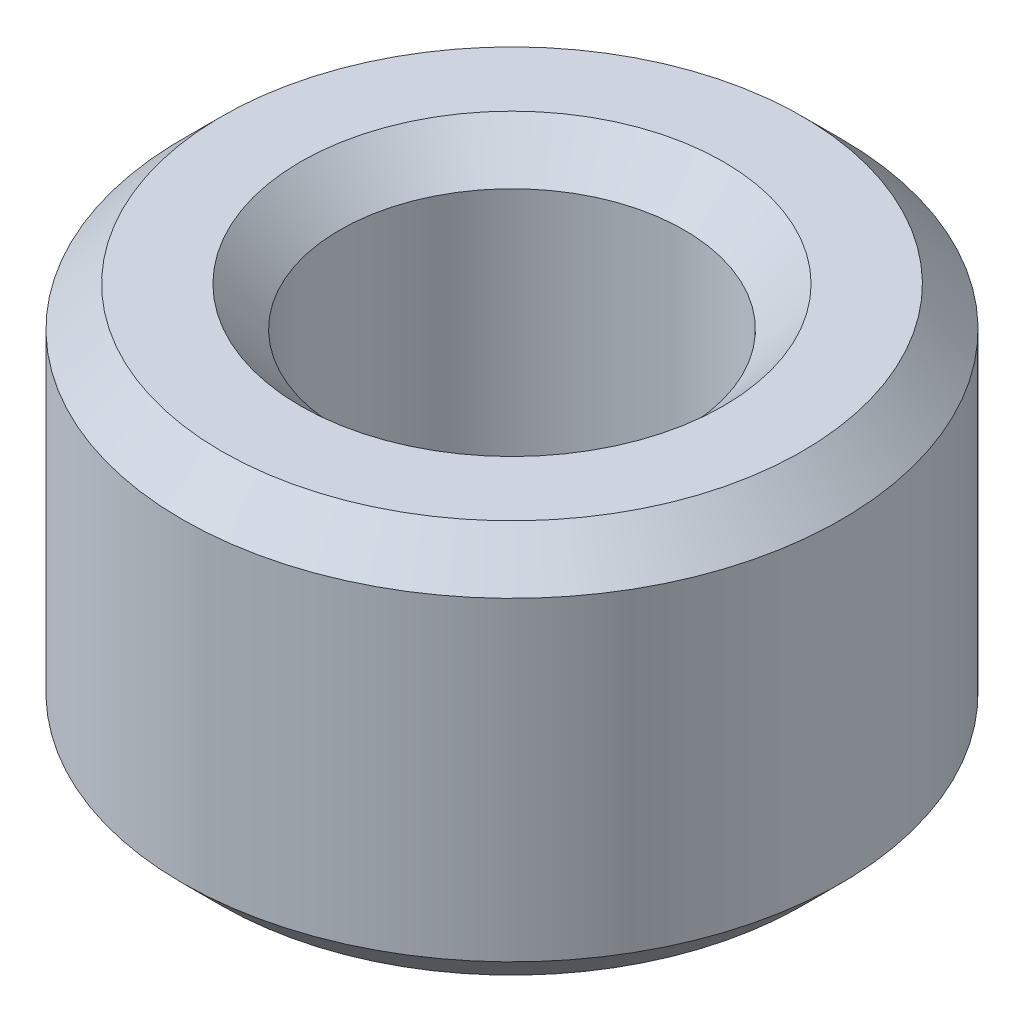
ISO-10303-21;
HEADER;
FILE_DESCRIPTION(('STEP AP214'),'2;1');
FILE_NAME('part.step','',(''),(''),'','','');
FILE_SCHEMA(('AUTOMOTIVE_DESIGN { 1 0 10303 214 1 1 1 1 }'));
ENDSEC;
DATA;
#1=APPLICATION_CONTEXT('core data for automotive mechanical design processes');
#2=APPLICATION_PROTOCOL_DEFINITION('international standard','automotive_design',2000,#1);
#3=PRODUCT_CONTEXT('',#1,'mechanical');
#4=PRODUCT('Part','Part','',(#3));
#5=PRODUCT_RELATED_PRODUCT_CATEGORY('part','',(#4));
#6=PRODUCT_DEFINITION_FORMATION('','',#4);
#7=PRODUCT_DEFINITION_CONTEXT('part definition',#1,'design');
#8=PRODUCT_DEFINITION('design','',#6,#7);
#9=PRODUCT_DEFINITION_SHAPE('','',#8);
#10=(LENGTH_UNIT() NAMED_UNIT(*) SI_UNIT(.MILLI.,.METRE.));
#11=(NAMED_UNIT(*) PLANE_ANGLE_UNIT() SI_UNIT($,.RADIAN.));
#12=(NAMED_UNIT(*) SI_UNIT($,.STERADIAN.) SOLID_ANGLE_UNIT());
#13=UNCERTAINTY_MEASURE_WITH_UNIT(LENGTH_MEASURE(1.E-05),#10,'distance_accuracy_value','');
#14=(GEOMETRIC_REPRESENTATION_CONTEXT(3) GLOBAL_UNCERTAINTY_ASSIGNED_CONTEXT((#13)) GLOBAL_UNIT_ASSIGNED_CONTEXT((#10,
#11,#12)) REPRESENTATION_CONTEXT('',''));
#15=CARTESIAN_POINT('',(0.,0.,0.));
#16=DIRECTION('',(0.,0.,1.));
#17=DIRECTION('',(1.,0.,0.));
#18=AXIS2_PLACEMENT_3D('',#15,#16,#17);
#19=CARTESIAN_POINT('',(0.,4.,0.));
#20=DIRECTION('',(0.,1.,0.));
#21=DIRECTION('',(0.,0.,1.));
#22=AXIS2_PLACEMENT_3D('',#19,#20,#21);
#23=PLANE('',#22);
#24=CARTESIAN_POINT('',(0.,4.,0.));
#25=DIRECTION('',(0.,1.,0.));
#26=DIRECTION('',(0.,0.,1.));
#27=AXIS2_PLACEMENT_3D('',#24,#25,#26);
#28=CIRCLE('',#27,2.95);
#29=CARTESIAN_POINT('',(0.,4.,2.95));
#30=VERTEX_POINT('',#29);
#31=EDGE_CURVE('E10',#30,#30,#28,.T.);
#32=ORIENTED_EDGE('',*,*,#31,.T.);
#33=EDGE_LOOP('',(#32));
#34=FACE_BOUND('',#33,.T.);
#35=CARTESIAN_POINT('',(0.,4.,0.));
#36=DIRECTION('',(0.,1.,0.));
#37=DIRECTION('',(0.,0.,1.));
#38=AXIS2_PLACEMENT_3D('',#35,#36,#37);
#39=CIRCLE('',#38,2.15);
#40=CARTESIAN_POINT('',(0.,4.,2.15));
#41=VERTEX_POINT('',#40);
#42=EDGE_CURVE('E41',#41,#41,#39,.F.);
#43=ORIENTED_EDGE('',*,*,#42,.T.);
#44=EDGE_LOOP('',(#43));
#45=FACE_BOUND('',#44,.T.);
#46=ADVANCED_FACE('F33',(#34,#45),#23,.T.);
#47=CARTESIAN_POINT('',(0.,0.,0.));
#48=DIRECTION('',(0.,1.,0.));
#49=DIRECTION('',(0.,0.,1.));
#50=AXIS2_PLACEMENT_3D('',#47,#48,#49);
#51=PLANE('',#50);
#52=CARTESIAN_POINT('',(0.,0.,0.));
#53=DIRECTION('',(0.,1.,0.));
#54=DIRECTION('',(0.,0.,1.));
#55=AXIS2_PLACEMENT_3D('',#52,#53,#54);
#56=CIRCLE('',#55,2.95);
#57=CARTESIAN_POINT('',(0.,0.,2.95));
#58=VERTEX_POINT('',#57);
#59=EDGE_CURVE('E54',#58,#58,#56,.F.);
#60=ORIENTED_EDGE('',*,*,#59,.T.);
#61=EDGE_LOOP('',(#60));
#62=FACE_BOUND('',#61,.T.);
#63=CARTESIAN_POINT('',(0.,0.,0.));
#64=DIRECTION('',(0.,1.,0.));
#65=DIRECTION('',(0.,0.,1.));
#66=AXIS2_PLACEMENT_3D('',#63,#64,#65);
#67=CIRCLE('',#66,2.15);
#68=CARTESIAN_POINT('',(0.,0.,2.15));
#69=VERTEX_POINT('',#68);
#70=EDGE_CURVE('E57',#69,#69,#67,.T.);
#71=ORIENTED_EDGE('',*,*,#70,.T.);
#72=EDGE_LOOP('',(#71));
#73=FACE_BOUND('',#72,.T.);
#74=ADVANCED_FACE('F83',(#62,#73),#51,.F.);
#75=CARTESIAN_POINT('',(0.,4.,0.));
#76=DIRECTION('',(0.,-1.,0.));
#77=DIRECTION('',(0.,0.,-1.));
#78=AXIS2_PLACEMENT_3D('',#75,#76,#77);
#79=CYLINDRICAL_SURFACE('',#78,3.35);
#80=CARTESIAN_POINT('',(0.,0.400000000000001,0.));
#81=DIRECTION('',(0.,1.,0.));
#82=DIRECTION('',(0.,0.,1.));
#83=AXIS2_PLACEMENT_3D('',#80,#81,#82);
#84=CIRCLE('',#83,3.35);
#85=CARTESIAN_POINT('',(0.,0.400000000000001,3.35));
#86=VERTEX_POINT('',#85);
#87=EDGE_CURVE('E60',#86,#86,#84,.T.);
#88=ORIENTED_EDGE('',*,*,#87,.T.);
#89=EDGE_LOOP('',(#88));
#90=FACE_BOUND('',#89,.T.);
#91=CARTESIAN_POINT('',(0.,3.6,0.));
#92=DIRECTION('',(0.,1.,0.));
#93=DIRECTION('',(0.,0.,1.));
#94=AXIS2_PLACEMENT_3D('',#91,#92,#93);
#95=CIRCLE('',#94,3.35);
#96=CARTESIAN_POINT('',(0.,3.6,3.35));
#97=VERTEX_POINT('',#96);
#98=EDGE_CURVE('E63',#97,#97,#95,.F.);
#99=ORIENTED_EDGE('',*,*,#98,.T.);
#100=EDGE_LOOP('',(#99));
#101=FACE_BOUND('',#100,.T.);
#102=ADVANCED_FACE('F67',(#90,#101),#79,.T.);
#103=CARTESIAN_POINT('',(0.,4.,0.));
#104=DIRECTION('',(0.,-1.,0.));
#105=DIRECTION('',(0.,0.,-1.));
#106=AXIS2_PLACEMENT_3D('',#103,#104,#105);
#107=CYLINDRICAL_SURFACE('',#106,1.75);
#108=CARTESIAN_POINT('',(0.,0.400000000000002,0.));
#109=DIRECTION('',(0.,1.,0.));
#110=DIRECTION('',(0.,0.,1.));
#111=AXIS2_PLACEMENT_3D('',#108,#109,#110);
#112=CIRCLE('',#111,1.75);
#113=CARTESIAN_POINT('',(0.,0.400000000000002,1.75));
#114=VERTEX_POINT('',#113);
#115=EDGE_CURVE('E45',#114,#114,#112,.F.);
#116=ORIENTED_EDGE('',*,*,#115,.T.);
#117=EDGE_LOOP('',(#116));
#118=FACE_BOUND('',#117,.T.);
#119=CARTESIAN_POINT('',(0.,3.6,0.));
#120=DIRECTION('',(0.,1.,0.));
#121=DIRECTION('',(0.,0.,1.));
#122=AXIS2_PLACEMENT_3D('',#119,#120,#121);
#123=CIRCLE('',#122,1.75);
#124=CARTESIAN_POINT('',(0.,3.6,1.75));
#125=VERTEX_POINT('',#124);
#126=EDGE_CURVE('E49',#125,#125,#123,.T.);
#127=ORIENTED_EDGE('',*,*,#126,.T.);
#128=EDGE_LOOP('',(#127));
#129=FACE_BOUND('',#128,.T.);
#130=ADVANCED_FACE('F91',(#118,#129),#107,.F.);
#131=CARTESIAN_POINT('',(0.,0.400000000000001,0.));
#132=DIRECTION('',(0.,1.,0.));
#133=DIRECTION('',(0.,0.,1.));
#134=AXIS2_PLACEMENT_3D('',#131,#132,#133);
#135=CONICAL_SURFACE('',#134,3.35,0.78539816339745);
#136=ORIENTED_EDGE('',*,*,#59,.F.);
#137=EDGE_LOOP('',(#136));
#138=FACE_BOUND('',#137,.T.);
#139=ORIENTED_EDGE('',*,*,#87,.F.);
#140=EDGE_LOOP('',(#139));
#141=FACE_BOUND('',#140,.T.);
#142=ADVANCED_FACE('F78',(#138,#141),#135,.T.);
#143=CARTESIAN_POINT('',(0.,0.,0.));
#144=DIRECTION('',(0.,-1.,0.));
#145=DIRECTION('',(0.,0.,-1.));
#146=AXIS2_PLACEMENT_3D('',#143,#144,#145);
#147=CONICAL_SURFACE('',#146,2.15,0.785398163397446);
#148=ORIENTED_EDGE('',*,*,#115,.F.);
#149=EDGE_LOOP('',(#148));
#150=FACE_BOUND('',#149,.T.);
#151=ORIENTED_EDGE('',*,*,#70,.F.);
#152=EDGE_LOOP('',(#151));
#153=FACE_BOUND('',#152,.T.);
#154=ADVANCED_FACE('F72',(#150,#153),#147,.F.);
#155=CARTESIAN_POINT('',(0.,4.,0.));
#156=DIRECTION('',(0.,-1.,0.));
#157=DIRECTION('',(0.,0.,-1.));
#158=AXIS2_PLACEMENT_3D('',#155,#156,#157);
#159=CONICAL_SURFACE('',#158,2.95,0.785398163397446);
#160=ORIENTED_EDGE('',*,*,#98,.F.);
#161=EDGE_LOOP('',(#160));
#162=FACE_BOUND('',#161,.T.);
#163=ORIENTED_EDGE('',*,*,#31,.F.);
#164=EDGE_LOOP('',(#163));
#165=FACE_BOUND('',#164,.T.);
#166=ADVANCED_FACE('F69',(#162,#165),#159,.T.);
#167=CARTESIAN_POINT('',(0.,3.6,0.));
#168=DIRECTION('',(0.,1.,0.));
#169=DIRECTION('',(0.,0.,1.));
#170=AXIS2_PLACEMENT_3D('',#167,#168,#169);
#171=CONICAL_SURFACE('',#170,1.75,0.785398163397451);
#172=ORIENTED_EDGE('',*,*,#42,.F.);
#173=EDGE_LOOP('',(#172));
#174=FACE_BOUND('',#173,.T.);
#175=ORIENTED_EDGE('',*,*,#126,.F.);
#176=EDGE_LOOP('',(#175));
#177=FACE_BOUND('',#176,.T.);
#178=ADVANCED_FACE('F36',(#174,#177),#171,.F.);
#179=CLOSED_SHELL('',(#46,#74,#102,#130,#142,#154,#166,#178));
#180=MANIFOLD_SOLID_BREP('B2',#179);
#181=ADVANCED_BREP_SHAPE_REPRESENTATION('',(#18,#180),#14);
#182=SHAPE_DEFINITION_REPRESENTATION(#9,#181);
ENDSEC;
END-ISO-10303-21;
